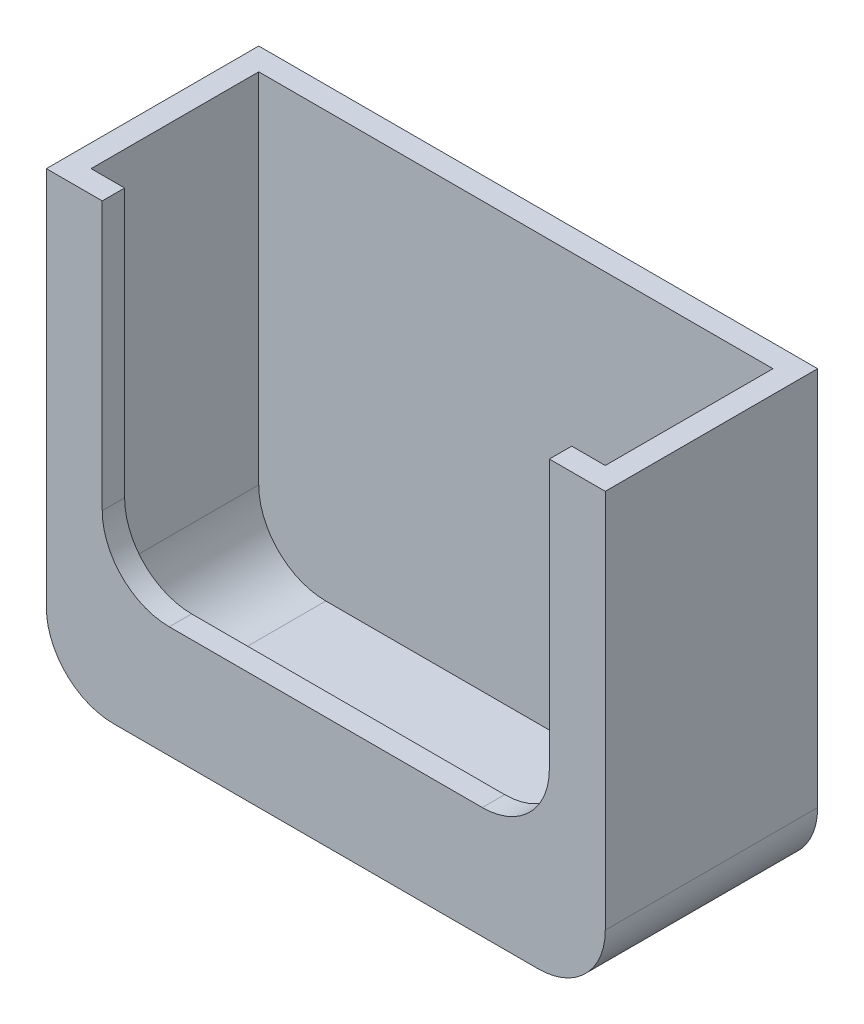
ISO-10303-21;
HEADER;
FILE_DESCRIPTION(('STEP AP214'),'2;1');
FILE_NAME('part.step','',(''),(''),'','','');
FILE_SCHEMA(('AUTOMOTIVE_DESIGN { 1 0 10303 214 1 1 1 1 }'));
ENDSEC;
DATA;
#1=APPLICATION_CONTEXT('core data for automotive mechanical design processes');
#2=APPLICATION_PROTOCOL_DEFINITION('international standard','automotive_design',2000,#1);
#3=PRODUCT_CONTEXT('',#1,'mechanical');
#4=PRODUCT('Part','Part','',(#3));
#5=PRODUCT_RELATED_PRODUCT_CATEGORY('part','',(#4));
#6=PRODUCT_DEFINITION_FORMATION('','',#4);
#7=PRODUCT_DEFINITION_CONTEXT('part definition',#1,'design');
#8=PRODUCT_DEFINITION('design','',#6,#7);
#9=PRODUCT_DEFINITION_SHAPE('','',#8);
#10=(LENGTH_UNIT() NAMED_UNIT(*) SI_UNIT(.MILLI.,.METRE.));
#11=(NAMED_UNIT(*) PLANE_ANGLE_UNIT() SI_UNIT($,.RADIAN.));
#12=(NAMED_UNIT(*) SI_UNIT($,.STERADIAN.) SOLID_ANGLE_UNIT());
#13=UNCERTAINTY_MEASURE_WITH_UNIT(LENGTH_MEASURE(1.E-05),#10,'distance_accuracy_value','');
#14=(GEOMETRIC_REPRESENTATION_CONTEXT(3) GLOBAL_UNCERTAINTY_ASSIGNED_CONTEXT((#13)) GLOBAL_UNIT_ASSIGNED_CONTEXT((#10,
#11,#12)) REPRESENTATION_CONTEXT('',''));
#15=CARTESIAN_POINT('',(0.,0.,0.));
#16=DIRECTION('',(0.,0.,1.));
#17=DIRECTION('',(1.,0.,0.));
#18=AXIS2_PLACEMENT_3D('',#15,#16,#17);
#19=CARTESIAN_POINT('',(25.,-20.,19.));
#20=DIRECTION('',(-1.,0.,0.));
#21=DIRECTION('',(0.,0.,1.));
#22=AXIS2_PLACEMENT_3D('',#19,#20,#21);
#23=PLANE('',#22);
#24=DIRECTION('',(0.,1.,0.));
#25=VECTOR('',#24,1.);
#26=CARTESIAN_POINT('',(25.,-20.,19.));
#27=LINE('',#26,#25);
#28=CARTESIAN_POINT('',(25.,-14.,19.));
#29=VERTEX_POINT('',#28);
#30=CARTESIAN_POINT('',(25.,20.,19.));
#31=VERTEX_POINT('',#30);
#32=EDGE_CURVE('E212',#29,#31,#27,.T.);
#33=ORIENTED_EDGE('',*,*,#32,.F.);
#34=DIRECTION('',(0.,0.,-1.));
#35=VECTOR('',#34,1.);
#36=CARTESIAN_POINT('',(25.,-14.,19.));
#37=LINE('',#36,#35);
#38=CARTESIAN_POINT('',(25.,-14.,0.));
#39=VERTEX_POINT('',#38);
#40=EDGE_CURVE('E253',#29,#39,#37,.T.);
#41=ORIENTED_EDGE('',*,*,#40,.T.);
#42=DIRECTION('',(0.,1.,0.));
#43=VECTOR('',#42,1.);
#44=CARTESIAN_POINT('',(25.,-20.,0.));
#45=LINE('',#44,#43);
#46=CARTESIAN_POINT('',(25.,20.,0.));
#47=VERTEX_POINT('',#46);
#48=EDGE_CURVE('E205',#39,#47,#45,.T.);
#49=ORIENTED_EDGE('',*,*,#48,.T.);
#50=DIRECTION('',(0.,0.,-1.));
#51=VECTOR('',#50,1.);
#52=CARTESIAN_POINT('',(25.,20.,19.));
#53=LINE('',#52,#51);
#54=EDGE_CURVE('E235',#31,#47,#53,.T.);
#55=ORIENTED_EDGE('',*,*,#54,.F.);
#56=EDGE_LOOP('',(#33,#41,#49,#55));
#57=FACE_BOUND('',#56,.T.);
#58=ADVANCED_FACE('F36',(#57),#23,.F.);
#59=CARTESIAN_POINT('',(-25.,20.,19.));
#60=DIRECTION('',(0.,-1.,0.));
#61=DIRECTION('',(0.,0.,-1.));
#62=AXIS2_PLACEMENT_3D('',#59,#60,#61);
#63=PLANE('',#62);
#64=DIRECTION('',(1.,0.,0.));
#65=VECTOR('',#64,1.);
#66=CARTESIAN_POINT('',(-23.,20.,17.));
#67=LINE('',#66,#65);
#68=CARTESIAN_POINT('',(20.,20.,17.));
#69=VERTEX_POINT('',#68);
#70=CARTESIAN_POINT('',(23.,20.,17.));
#71=VERTEX_POINT('',#70);
#72=EDGE_CURVE('E165',#69,#71,#67,.T.);
#73=ORIENTED_EDGE('',*,*,#72,.F.);
#74=DIRECTION('',(0.,0.,-1.));
#75=VECTOR('',#74,1.);
#76=CARTESIAN_POINT('',(20.,20.,19.));
#77=LINE('',#76,#75);
#78=CARTESIAN_POINT('',(20.,20.,19.));
#79=VERTEX_POINT('',#78);
#80=EDGE_CURVE('E174',#79,#69,#77,.T.);
#81=ORIENTED_EDGE('',*,*,#80,.F.);
#82=DIRECTION('',(-1.,0.,0.));
#83=VECTOR('',#82,1.);
#84=CARTESIAN_POINT('',(-25.,20.,19.));
#85=LINE('',#84,#83);
#86=EDGE_CURVE('E216',#31,#79,#85,.T.);
#87=ORIENTED_EDGE('',*,*,#86,.F.);
#88=ORIENTED_EDGE('',*,*,#54,.T.);
#89=DIRECTION('',(-1.,0.,0.));
#90=VECTOR('',#89,1.);
#91=CARTESIAN_POINT('',(-25.,20.,0.));
#92=LINE('',#91,#90);
#93=CARTESIAN_POINT('',(-25.,20.,0.));
#94=VERTEX_POINT('',#93);
#95=EDGE_CURVE('E226',#47,#94,#92,.T.);
#96=ORIENTED_EDGE('',*,*,#95,.T.);
#97=DIRECTION('',(0.,0.,-1.));
#98=VECTOR('',#97,1.);
#99=CARTESIAN_POINT('',(-25.,20.,19.));
#100=LINE('',#99,#98);
#101=CARTESIAN_POINT('',(-25.,20.,19.));
#102=VERTEX_POINT('',#101);
#103=EDGE_CURVE('E224',#102,#94,#100,.T.);
#104=ORIENTED_EDGE('',*,*,#103,.F.);
#105=CARTESIAN_POINT('',(-20.,20.,19.));
#106=VERTEX_POINT('',#105);
#107=EDGE_CURVE('E214',#106,#102,#85,.T.);
#108=ORIENTED_EDGE('',*,*,#107,.F.);
#109=DIRECTION('',(0.,0.,1.));
#110=VECTOR('',#109,1.);
#111=CARTESIAN_POINT('',(-20.,20.,19.));
#112=LINE('',#111,#110);
#113=CARTESIAN_POINT('',(-20.,20.,17.));
#114=VERTEX_POINT('',#113);
#115=EDGE_CURVE('E181',#114,#106,#112,.T.);
#116=ORIENTED_EDGE('',*,*,#115,.F.);
#117=CARTESIAN_POINT('',(-23.,20.,17.));
#118=VERTEX_POINT('',#117);
#119=EDGE_CURVE('E187',#118,#114,#67,.T.);
#120=ORIENTED_EDGE('',*,*,#119,.F.);
#121=DIRECTION('',(0.,0.,-1.));
#122=VECTOR('',#121,1.);
#123=CARTESIAN_POINT('',(-23.,20.,17.));
#124=LINE('',#123,#122);
#125=CARTESIAN_POINT('',(-23.,20.,2.));
#126=VERTEX_POINT('',#125);
#127=EDGE_CURVE('E199',#118,#126,#124,.T.);
#128=ORIENTED_EDGE('',*,*,#127,.T.);
#129=DIRECTION('',(1.,0.,0.));
#130=VECTOR('',#129,1.);
#131=CARTESIAN_POINT('',(-23.,20.,2.));
#132=LINE('',#131,#130);
#133=CARTESIAN_POINT('',(23.,20.,2.));
#134=VERTEX_POINT('',#133);
#135=EDGE_CURVE('E197',#126,#134,#132,.T.);
#136=ORIENTED_EDGE('',*,*,#135,.T.);
#137=DIRECTION('',(0.,0.,-1.));
#138=VECTOR('',#137,1.);
#139=CARTESIAN_POINT('',(23.,20.,17.));
#140=LINE('',#139,#138);
#141=EDGE_CURVE('E186',#71,#134,#140,.T.);
#142=ORIENTED_EDGE('',*,*,#141,.F.);
#143=EDGE_LOOP('',(#73,#81,#87,#88,#96,#104,#108,#116,#120,#128,#136,#142));
#144=FACE_BOUND('',#143,.T.);
#145=ADVANCED_FACE('F183',(#144),#63,.F.);
#146=CARTESIAN_POINT('',(-25.,-20.,19.));
#147=DIRECTION('',(1.,0.,0.));
#148=DIRECTION('',(0.,0.,-1.));
#149=AXIS2_PLACEMENT_3D('',#146,#147,#148);
#150=PLANE('',#149);
#151=DIRECTION('',(0.,-1.,0.));
#152=VECTOR('',#151,1.);
#153=CARTESIAN_POINT('',(-25.,-20.,0.));
#154=LINE('',#153,#152);
#155=CARTESIAN_POINT('',(-25.,-14.,0.));
#156=VERTEX_POINT('',#155);
#157=EDGE_CURVE('E228',#94,#156,#154,.T.);
#158=ORIENTED_EDGE('',*,*,#157,.T.);
#159=DIRECTION('',(0.,0.,-1.));
#160=VECTOR('',#159,1.);
#161=CARTESIAN_POINT('',(-25.,-14.,19.));
#162=LINE('',#161,#160);
#163=CARTESIAN_POINT('',(-25.,-14.,19.));
#164=VERTEX_POINT('',#163);
#165=EDGE_CURVE('E247',#156,#164,#162,.F.);
#166=ORIENTED_EDGE('',*,*,#165,.T.);
#167=DIRECTION('',(0.,-1.,0.));
#168=VECTOR('',#167,1.);
#169=CARTESIAN_POINT('',(-25.,-20.,19.));
#170=LINE('',#169,#168);
#171=EDGE_CURVE('E218',#102,#164,#170,.T.);
#172=ORIENTED_EDGE('',*,*,#171,.F.);
#173=ORIENTED_EDGE('',*,*,#103,.T.);
#174=EDGE_LOOP('',(#158,#166,#172,#173));
#175=FACE_BOUND('',#174,.T.);
#176=ADVANCED_FACE('F344',(#175),#150,.F.);
#177=CARTESIAN_POINT('',(-25.,-20.,19.));
#178=DIRECTION('',(0.,1.,0.));
#179=DIRECTION('',(0.,0.,1.));
#180=AXIS2_PLACEMENT_3D('',#177,#178,#179);
#181=PLANE('',#180);
#182=DIRECTION('',(1.,0.,0.));
#183=VECTOR('',#182,1.);
#184=CARTESIAN_POINT('',(-25.,-20.,19.));
#185=LINE('',#184,#183);
#186=CARTESIAN_POINT('',(-19.,-20.,19.));
#187=VERTEX_POINT('',#186);
#188=CARTESIAN_POINT('',(19.,-20.,19.));
#189=VERTEX_POINT('',#188);
#190=EDGE_CURVE('E221',#187,#189,#185,.T.);
#191=ORIENTED_EDGE('',*,*,#190,.F.);
#192=DIRECTION('',(0.,0.,-1.));
#193=VECTOR('',#192,1.);
#194=CARTESIAN_POINT('',(-19.,-20.,19.));
#195=LINE('',#194,#193);
#196=CARTESIAN_POINT('',(-19.,-20.,0.));
#197=VERTEX_POINT('',#196);
#198=EDGE_CURVE('E240',#187,#197,#195,.T.);
#199=ORIENTED_EDGE('',*,*,#198,.T.);
#200=DIRECTION('',(1.,0.,0.));
#201=VECTOR('',#200,1.);
#202=CARTESIAN_POINT('',(-25.,-20.,0.));
#203=LINE('',#202,#201);
#204=CARTESIAN_POINT('',(19.,-20.,0.));
#205=VERTEX_POINT('',#204);
#206=EDGE_CURVE('E215',#197,#205,#203,.T.);
#207=ORIENTED_EDGE('',*,*,#206,.T.);
#208=DIRECTION('',(0.,0.,-1.));
#209=VECTOR('',#208,1.);
#210=CARTESIAN_POINT('',(19.,-20.,19.));
#211=LINE('',#210,#209);
#212=EDGE_CURVE('E238',#205,#189,#211,.F.);
#213=ORIENTED_EDGE('',*,*,#212,.T.);
#214=EDGE_LOOP('',(#191,#199,#207,#213));
#215=FACE_BOUND('',#214,.T.);
#216=ADVANCED_FACE('F352',(#215),#181,.F.);
#217=CARTESIAN_POINT('',(0.,0.,19.));
#218=DIRECTION('',(0.,0.,-1.));
#219=DIRECTION('',(-1.,0.,0.));
#220=AXIS2_PLACEMENT_3D('',#217,#218,#219);
#221=PLANE('',#220);
#222=ORIENTED_EDGE('',*,*,#171,.T.);
#223=CARTESIAN_POINT('',(-19.,-14.,19.));
#224=DIRECTION('',(0.,0.,-1.));
#225=DIRECTION('',(-1.,0.,0.));
#226=AXIS2_PLACEMENT_3D('',#223,#224,#225);
#227=CIRCLE('',#226,6.);
#228=EDGE_CURVE('E251',#164,#187,#227,.F.);
#229=ORIENTED_EDGE('',*,*,#228,.T.);
#230=ORIENTED_EDGE('',*,*,#190,.T.);
#231=CARTESIAN_POINT('',(19.,-14.,19.));
#232=DIRECTION('',(0.,0.,-1.));
#233=DIRECTION('',(-1.,0.,0.));
#234=AXIS2_PLACEMENT_3D('',#231,#232,#233);
#235=CIRCLE('',#234,6.);
#236=EDGE_CURVE('E249',#189,#29,#235,.F.);
#237=ORIENTED_EDGE('',*,*,#236,.T.);
#238=ORIENTED_EDGE('',*,*,#32,.T.);
#239=ORIENTED_EDGE('',*,*,#86,.T.);
#240=DIRECTION('',(0.,1.,0.));
#241=VECTOR('',#240,1.);
#242=CARTESIAN_POINT('',(20.,-10.,19.));
#243=LINE('',#242,#241);
#244=CARTESIAN_POINT('',(20.,-4.,19.));
#245=VERTEX_POINT('',#244);
#246=EDGE_CURVE('E177',#245,#79,#243,.T.);
#247=ORIENTED_EDGE('',*,*,#246,.F.);
#248=CARTESIAN_POINT('',(14.,-4.,19.));
#249=DIRECTION('',(0.,0.,-1.));
#250=DIRECTION('',(-1.,0.,0.));
#251=AXIS2_PLACEMENT_3D('',#248,#249,#250);
#252=CIRCLE('',#251,6.);
#253=CARTESIAN_POINT('',(14.,-10.,19.));
#254=VERTEX_POINT('',#253);
#255=EDGE_CURVE('E11',#245,#254,#252,.T.);
#256=ORIENTED_EDGE('',*,*,#255,.T.);
#257=DIRECTION('',(1.,0.,0.));
#258=VECTOR('',#257,1.);
#259=CARTESIAN_POINT('',(-20.,-10.,19.));
#260=LINE('',#259,#258);
#261=CARTESIAN_POINT('',(-14.,-10.,19.));
#262=VERTEX_POINT('',#261);
#263=EDGE_CURVE('E171',#262,#254,#260,.T.);
#264=ORIENTED_EDGE('',*,*,#263,.F.);
#265=CARTESIAN_POINT('',(-14.,-4.,19.));
#266=DIRECTION('',(0.,0.,-1.));
#267=DIRECTION('',(-1.,0.,0.));
#268=AXIS2_PLACEMENT_3D('',#265,#266,#267);
#269=CIRCLE('',#268,6.);
#270=CARTESIAN_POINT('',(-20.,-4.,19.));
#271=VERTEX_POINT('',#270);
#272=EDGE_CURVE('E282',#262,#271,#269,.T.);
#273=ORIENTED_EDGE('',*,*,#272,.T.);
#274=DIRECTION('',(0.,1.,0.));
#275=VECTOR('',#274,1.);
#276=CARTESIAN_POINT('',(-20.,-10.,19.));
#277=LINE('',#276,#275);
#278=EDGE_CURVE('E190',#271,#106,#277,.T.);
#279=ORIENTED_EDGE('',*,*,#278,.T.);
#280=ORIENTED_EDGE('',*,*,#107,.T.);
#281=EDGE_LOOP('',(#222,#229,#230,#237,#238,#239,#247,#256,#264,#273,#279,#280));
#282=FACE_BOUND('',#281,.T.);
#283=ADVANCED_FACE('F301',(#282),#221,.F.);
#284=CARTESIAN_POINT('',(0.,0.,0.));
#285=DIRECTION('',(0.,0.,-1.));
#286=DIRECTION('',(-1.,0.,0.));
#287=AXIS2_PLACEMENT_3D('',#284,#285,#286);
#288=PLANE('',#287);
#289=ORIENTED_EDGE('',*,*,#206,.F.);
#290=CARTESIAN_POINT('',(-19.,-14.,0.));
#291=DIRECTION('',(0.,0.,-1.));
#292=DIRECTION('',(-1.,0.,0.));
#293=AXIS2_PLACEMENT_3D('',#290,#291,#292);
#294=CIRCLE('',#293,6.);
#295=EDGE_CURVE('E245',#197,#156,#294,.T.);
#296=ORIENTED_EDGE('',*,*,#295,.T.);
#297=ORIENTED_EDGE('',*,*,#157,.F.);
#298=ORIENTED_EDGE('',*,*,#95,.F.);
#299=ORIENTED_EDGE('',*,*,#48,.F.);
#300=CARTESIAN_POINT('',(19.,-14.,0.));
#301=DIRECTION('',(0.,0.,-1.));
#302=DIRECTION('',(-1.,0.,0.));
#303=AXIS2_PLACEMENT_3D('',#300,#301,#302);
#304=CIRCLE('',#303,6.);
#305=EDGE_CURVE('E243',#39,#205,#304,.T.);
#306=ORIENTED_EDGE('',*,*,#305,.T.);
#307=EDGE_LOOP('',(#289,#296,#297,#298,#299,#306));
#308=FACE_BOUND('',#307,.T.);
#309=ADVANCED_FACE('F341',(#308),#288,.T.);
#310=CARTESIAN_POINT('',(-23.,-18.,17.));
#311=DIRECTION('',(0.,0.,1.));
#312=DIRECTION('',(1.,0.,0.));
#313=AXIS2_PLACEMENT_3D('',#310,#311,#312);
#314=PLANE('',#313);
#315=DIRECTION('',(0.,1.,0.));
#316=VECTOR('',#315,1.);
#317=CARTESIAN_POINT('',(23.,-18.,17.));
#318=LINE('',#317,#316);
#319=CARTESIAN_POINT('',(23.,-12.,17.));
#320=VERTEX_POINT('',#319);
#321=EDGE_CURVE('E210',#320,#71,#318,.T.);
#322=ORIENTED_EDGE('',*,*,#321,.F.);
#323=CARTESIAN_POINT('',(17.,-12.,17.));
#324=DIRECTION('',(0.,0.,1.));
#325=DIRECTION('',(1.,0.,0.));
#326=AXIS2_PLACEMENT_3D('',#323,#324,#325);
#327=CIRCLE('',#326,6.);
#328=CARTESIAN_POINT('',(17.,-18.,17.));
#329=VERTEX_POINT('',#328);
#330=EDGE_CURVE('E277',#320,#329,#327,.F.);
#331=ORIENTED_EDGE('',*,*,#330,.T.);
#332=DIRECTION('',(1.,0.,0.));
#333=VECTOR('',#332,1.);
#334=CARTESIAN_POINT('',(-23.,-18.,17.));
#335=LINE('',#334,#333);
#336=CARTESIAN_POINT('',(-17.,-18.,17.));
#337=VERTEX_POINT('',#336);
#338=EDGE_CURVE('E202',#337,#329,#335,.T.);
#339=ORIENTED_EDGE('',*,*,#338,.F.);
#340=CARTESIAN_POINT('',(-17.,-12.,17.));
#341=DIRECTION('',(0.,0.,1.));
#342=DIRECTION('',(1.,0.,0.));
#343=AXIS2_PLACEMENT_3D('',#340,#341,#342);
#344=CIRCLE('',#343,6.);
#345=CARTESIAN_POINT('',(-23.,-12.,17.));
#346=VERTEX_POINT('',#345);
#347=EDGE_CURVE('E51',#337,#346,#344,.F.);
#348=ORIENTED_EDGE('',*,*,#347,.T.);
#349=DIRECTION('',(0.,1.,0.));
#350=VECTOR('',#349,1.);
#351=CARTESIAN_POINT('',(-23.,-18.,17.));
#352=LINE('',#351,#350);
#353=EDGE_CURVE('E203',#346,#118,#352,.T.);
#354=ORIENTED_EDGE('',*,*,#353,.T.);
#355=ORIENTED_EDGE('',*,*,#119,.T.);
#356=DIRECTION('',(0.,1.,0.));
#357=VECTOR('',#356,1.);
#358=CARTESIAN_POINT('',(-20.,-10.,17.));
#359=LINE('',#358,#357);
#360=CARTESIAN_POINT('',(-20.,-4.,17.));
#361=VERTEX_POINT('',#360);
#362=EDGE_CURVE('E170',#361,#114,#359,.T.);
#363=ORIENTED_EDGE('',*,*,#362,.F.);
#364=CARTESIAN_POINT('',(-14.,-4.,17.));
#365=DIRECTION('',(0.,0.,1.));
#366=DIRECTION('',(1.,0.,0.));
#367=AXIS2_PLACEMENT_3D('',#364,#365,#366);
#368=CIRCLE('',#367,6.);
#369=CARTESIAN_POINT('',(-14.,-10.,17.));
#370=VERTEX_POINT('',#369);
#371=EDGE_CURVE('E284',#361,#370,#368,.T.);
#372=ORIENTED_EDGE('',*,*,#371,.T.);
#373=DIRECTION('',(-1.,0.,0.));
#374=VECTOR('',#373,1.);
#375=CARTESIAN_POINT('',(-20.,-10.,17.));
#376=LINE('',#375,#374);
#377=CARTESIAN_POINT('',(14.,-10.,17.));
#378=VERTEX_POINT('',#377);
#379=EDGE_CURVE('E288',#378,#370,#376,.T.);
#380=ORIENTED_EDGE('',*,*,#379,.F.);
#381=CARTESIAN_POINT('',(14.,-4.,17.));
#382=DIRECTION('',(0.,0.,1.));
#383=DIRECTION('',(1.,0.,0.));
#384=AXIS2_PLACEMENT_3D('',#381,#382,#383);
#385=CIRCLE('',#384,6.);
#386=CARTESIAN_POINT('',(20.,-4.,17.));
#387=VERTEX_POINT('',#386);
#388=EDGE_CURVE('E44',#378,#387,#385,.T.);
#389=ORIENTED_EDGE('',*,*,#388,.T.);
#390=DIRECTION('',(0.,1.,0.));
#391=VECTOR('',#390,1.);
#392=CARTESIAN_POINT('',(20.,-10.,17.));
#393=LINE('',#392,#391);
#394=EDGE_CURVE('E161',#387,#69,#393,.T.);
#395=ORIENTED_EDGE('',*,*,#394,.T.);
#396=ORIENTED_EDGE('',*,*,#72,.T.);
#397=EDGE_LOOP('',(#322,#331,#339,#348,#354,#355,#363,#372,#380,#389,#395,#396));
#398=FACE_BOUND('',#397,.T.);
#399=ADVANCED_FACE('F163',(#398),#314,.F.);
#400=CARTESIAN_POINT('',(-23.,-18.,17.));
#401=DIRECTION('',(1.,0.,0.));
#402=DIRECTION('',(0.,0.,-1.));
#403=AXIS2_PLACEMENT_3D('',#400,#401,#402);
#404=PLANE('',#403);
#405=ORIENTED_EDGE('',*,*,#353,.F.);
#406=DIRECTION('',(0.,0.,-1.));
#407=VECTOR('',#406,1.);
#408=CARTESIAN_POINT('',(-23.,-12.,2.));
#409=LINE('',#408,#407);
#410=CARTESIAN_POINT('',(-23.,-12.,2.));
#411=VERTEX_POINT('',#410);
#412=EDGE_CURVE('E279',#346,#411,#409,.T.);
#413=ORIENTED_EDGE('',*,*,#412,.T.);
#414=DIRECTION('',(0.,1.,0.));
#415=VECTOR('',#414,1.);
#416=CARTESIAN_POINT('',(-23.,-18.,2.));
#417=LINE('',#416,#415);
#418=EDGE_CURVE('E206',#411,#126,#417,.T.);
#419=ORIENTED_EDGE('',*,*,#418,.T.);
#420=ORIENTED_EDGE('',*,*,#127,.F.);
#421=EDGE_LOOP('',(#405,#413,#419,#420));
#422=FACE_BOUND('',#421,.T.);
#423=ADVANCED_FACE('F323',(#422),#404,.T.);
#424=CARTESIAN_POINT('',(-23.,-18.,2.));
#425=DIRECTION('',(0.,0.,1.));
#426=DIRECTION('',(1.,0.,0.));
#427=AXIS2_PLACEMENT_3D('',#424,#425,#426);
#428=PLANE('',#427);
#429=DIRECTION('',(1.,0.,0.));
#430=VECTOR('',#429,1.);
#431=CARTESIAN_POINT('',(-23.,-18.,2.));
#432=LINE('',#431,#430);
#433=CARTESIAN_POINT('',(-17.,-18.,2.));
#434=VERTEX_POINT('',#433);
#435=CARTESIAN_POINT('',(17.,-18.,2.));
#436=VERTEX_POINT('',#435);
#437=EDGE_CURVE('E194',#434,#436,#432,.T.);
#438=ORIENTED_EDGE('',*,*,#437,.T.);
#439=CARTESIAN_POINT('',(17.,-12.,2.));
#440=DIRECTION('',(0.,0.,1.));
#441=DIRECTION('',(1.,0.,0.));
#442=AXIS2_PLACEMENT_3D('',#439,#440,#441);
#443=CIRCLE('',#442,6.);
#444=CARTESIAN_POINT('',(23.,-12.,2.));
#445=VERTEX_POINT('',#444);
#446=EDGE_CURVE('E273',#436,#445,#443,.T.);
#447=ORIENTED_EDGE('',*,*,#446,.T.);
#448=DIRECTION('',(0.,1.,0.));
#449=VECTOR('',#448,1.);
#450=CARTESIAN_POINT('',(23.,-18.,2.));
#451=LINE('',#450,#449);
#452=EDGE_CURVE('E208',#445,#134,#451,.T.);
#453=ORIENTED_EDGE('',*,*,#452,.T.);
#454=ORIENTED_EDGE('',*,*,#135,.F.);
#455=ORIENTED_EDGE('',*,*,#418,.F.);
#456=CARTESIAN_POINT('',(-17.,-12.,2.));
#457=DIRECTION('',(0.,0.,1.));
#458=DIRECTION('',(1.,0.,0.));
#459=AXIS2_PLACEMENT_3D('',#456,#457,#458);
#460=CIRCLE('',#459,6.);
#461=EDGE_CURVE('E271',#411,#434,#460,.T.);
#462=ORIENTED_EDGE('',*,*,#461,.T.);
#463=EDGE_LOOP('',(#438,#447,#453,#454,#455,#462));
#464=FACE_BOUND('',#463,.T.);
#465=ADVANCED_FACE('F316',(#464),#428,.T.);
#466=CARTESIAN_POINT('',(23.,-18.,17.));
#467=DIRECTION('',(1.,0.,0.));
#468=DIRECTION('',(0.,0.,-1.));
#469=AXIS2_PLACEMENT_3D('',#466,#467,#468);
#470=PLANE('',#469);
#471=ORIENTED_EDGE('',*,*,#452,.F.);
#472=DIRECTION('',(0.,0.,-1.));
#473=VECTOR('',#472,1.);
#474=CARTESIAN_POINT('',(23.,-12.,17.));
#475=LINE('',#474,#473);
#476=EDGE_CURVE('E59',#445,#320,#475,.F.);
#477=ORIENTED_EDGE('',*,*,#476,.T.);
#478=ORIENTED_EDGE('',*,*,#321,.T.);
#479=ORIENTED_EDGE('',*,*,#141,.T.);
#480=EDGE_LOOP('',(#471,#477,#478,#479));
#481=FACE_BOUND('',#480,.T.);
#482=ADVANCED_FACE('F382',(#481),#470,.F.);
#483=CARTESIAN_POINT('',(0.,-18.,0.));
#484=DIRECTION('',(0.,1.,0.));
#485=DIRECTION('',(0.,0.,1.));
#486=AXIS2_PLACEMENT_3D('',#483,#484,#485);
#487=PLANE('',#486);
#488=ORIENTED_EDGE('',*,*,#338,.T.);
#489=DIRECTION('',(0.,0.,-1.));
#490=VECTOR('',#489,1.);
#491=CARTESIAN_POINT('',(17.,-18.,0.));
#492=LINE('',#491,#490);
#493=EDGE_CURVE('E268',#329,#436,#492,.T.);
#494=ORIENTED_EDGE('',*,*,#493,.T.);
#495=ORIENTED_EDGE('',*,*,#437,.F.);
#496=DIRECTION('',(0.,0.,-1.));
#497=VECTOR('',#496,1.);
#498=CARTESIAN_POINT('',(-17.,-18.,17.));
#499=LINE('',#498,#497);
#500=EDGE_CURVE('E266',#434,#337,#499,.F.);
#501=ORIENTED_EDGE('',*,*,#500,.T.);
#502=EDGE_LOOP('',(#488,#494,#495,#501));
#503=FACE_BOUND('',#502,.T.);
#504=ADVANCED_FACE('F319',(#503),#487,.T.);
#505=CARTESIAN_POINT('',(20.,-10.,19.));
#506=DIRECTION('',(1.,0.,0.));
#507=DIRECTION('',(0.,0.,-1.));
#508=AXIS2_PLACEMENT_3D('',#505,#506,#507);
#509=PLANE('',#508);
#510=ORIENTED_EDGE('',*,*,#394,.F.);
#511=DIRECTION('',(0.,0.,-1.));
#512=VECTOR('',#511,1.);
#513=CARTESIAN_POINT('',(20.,-4.,19.));
#514=LINE('',#513,#512);
#515=EDGE_CURVE('E264',#387,#245,#514,.F.);
#516=ORIENTED_EDGE('',*,*,#515,.T.);
#517=ORIENTED_EDGE('',*,*,#246,.T.);
#518=ORIENTED_EDGE('',*,*,#80,.T.);
#519=EDGE_LOOP('',(#510,#516,#517,#518));
#520=FACE_BOUND('',#519,.T.);
#521=ADVANCED_FACE('F175',(#520),#509,.F.);
#522=CARTESIAN_POINT('',(-20.,-10.,19.));
#523=DIRECTION('',(-1.,0.,0.));
#524=DIRECTION('',(0.,0.,1.));
#525=AXIS2_PLACEMENT_3D('',#522,#523,#524);
#526=PLANE('',#525);
#527=ORIENTED_EDGE('',*,*,#278,.F.);
#528=DIRECTION('',(0.,0.,1.));
#529=VECTOR('',#528,1.);
#530=CARTESIAN_POINT('',(-20.,-4.,17.));
#531=LINE('',#530,#529);
#532=EDGE_CURVE('E262',#271,#361,#531,.F.);
#533=ORIENTED_EDGE('',*,*,#532,.T.);
#534=ORIENTED_EDGE('',*,*,#362,.T.);
#535=ORIENTED_EDGE('',*,*,#115,.T.);
#536=EDGE_LOOP('',(#527,#533,#534,#535));
#537=FACE_BOUND('',#536,.T.);
#538=ADVANCED_FACE('F304',(#537),#526,.F.);
#539=CARTESIAN_POINT('',(0.,-10.,0.));
#540=DIRECTION('',(0.,-1.,0.));
#541=DIRECTION('',(0.,0.,-1.));
#542=AXIS2_PLACEMENT_3D('',#539,#540,#541);
#543=PLANE('',#542);
#544=ORIENTED_EDGE('',*,*,#379,.T.);
#545=DIRECTION('',(0.,0.,1.));
#546=VECTOR('',#545,1.);
#547=CARTESIAN_POINT('',(-14.,-10.,19.));
#548=LINE('',#547,#546);
#549=EDGE_CURVE('E259',#370,#262,#548,.T.);
#550=ORIENTED_EDGE('',*,*,#549,.T.);
#551=ORIENTED_EDGE('',*,*,#263,.T.);
#552=DIRECTION('',(0.,0.,-1.));
#553=VECTOR('',#552,1.);
#554=CARTESIAN_POINT('',(14.,-10.,17.));
#555=LINE('',#554,#553);
#556=EDGE_CURVE('E256',#254,#378,#555,.T.);
#557=ORIENTED_EDGE('',*,*,#556,.T.);
#558=EDGE_LOOP('',(#544,#550,#551,#557));
#559=FACE_BOUND('',#558,.T.);
#560=ADVANCED_FACE('F293',(#559),#543,.F.);
#561=CARTESIAN_POINT('',(-19.,-14.,19.));
#562=DIRECTION('',(0.,0.,-1.));
#563=DIRECTION('',(-1.,0.,0.));
#564=AXIS2_PLACEMENT_3D('',#561,#562,#563);
#565=CYLINDRICAL_SURFACE('',#564,6.);
#566=ORIENTED_EDGE('',*,*,#228,.F.);
#567=ORIENTED_EDGE('',*,*,#165,.F.);
#568=ORIENTED_EDGE('',*,*,#295,.F.);
#569=ORIENTED_EDGE('',*,*,#198,.F.);
#570=EDGE_LOOP('',(#566,#567,#568,#569));
#571=FACE_BOUND('',#570,.T.);
#572=ADVANCED_FACE('F350',(#571),#565,.T.);
#573=CARTESIAN_POINT('',(19.,-14.,19.));
#574=DIRECTION('',(0.,0.,-1.));
#575=DIRECTION('',(-1.,0.,0.));
#576=AXIS2_PLACEMENT_3D('',#573,#574,#575);
#577=CYLINDRICAL_SURFACE('',#576,6.);
#578=ORIENTED_EDGE('',*,*,#236,.F.);
#579=ORIENTED_EDGE('',*,*,#212,.F.);
#580=ORIENTED_EDGE('',*,*,#305,.F.);
#581=ORIENTED_EDGE('',*,*,#40,.F.);
#582=EDGE_LOOP('',(#578,#579,#580,#581));
#583=FACE_BOUND('',#582,.T.);
#584=ADVANCED_FACE('F356',(#583),#577,.T.);
#585=CARTESIAN_POINT('',(-14.,-4.,0.));
#586=DIRECTION('',(0.,0.,-1.));
#587=DIRECTION('',(-1.,0.,0.));
#588=AXIS2_PLACEMENT_3D('',#585,#586,#587);
#589=CYLINDRICAL_SURFACE('',#588,6.);
#590=ORIENTED_EDGE('',*,*,#371,.F.);
#591=ORIENTED_EDGE('',*,*,#532,.F.);
#592=ORIENTED_EDGE('',*,*,#272,.F.);
#593=ORIENTED_EDGE('',*,*,#549,.F.);
#594=EDGE_LOOP('',(#590,#591,#592,#593));
#595=FACE_BOUND('',#594,.T.);
#596=ADVANCED_FACE('F298',(#595),#589,.F.);
#597=CARTESIAN_POINT('',(14.,-4.,0.));
#598=DIRECTION('',(0.,0.,1.));
#599=DIRECTION('',(1.,0.,0.));
#600=AXIS2_PLACEMENT_3D('',#597,#598,#599);
#601=CYLINDRICAL_SURFACE('',#600,6.);
#602=ORIENTED_EDGE('',*,*,#255,.F.);
#603=ORIENTED_EDGE('',*,*,#515,.F.);
#604=ORIENTED_EDGE('',*,*,#388,.F.);
#605=ORIENTED_EDGE('',*,*,#556,.F.);
#606=EDGE_LOOP('',(#602,#603,#604,#605));
#607=FACE_BOUND('',#606,.T.);
#608=ADVANCED_FACE('F331',(#607),#601,.F.);
#609=CARTESIAN_POINT('',(17.,-12.,0.));
#610=DIRECTION('',(0.,0.,-1.));
#611=DIRECTION('',(-1.,0.,0.));
#612=AXIS2_PLACEMENT_3D('',#609,#610,#611);
#613=CYLINDRICAL_SURFACE('',#612,6.);
#614=ORIENTED_EDGE('',*,*,#330,.F.);
#615=ORIENTED_EDGE('',*,*,#476,.F.);
#616=ORIENTED_EDGE('',*,*,#446,.F.);
#617=ORIENTED_EDGE('',*,*,#493,.F.);
#618=EDGE_LOOP('',(#614,#615,#616,#617));
#619=FACE_BOUND('',#618,.T.);
#620=ADVANCED_FACE('F423',(#619),#613,.F.);
#621=CARTESIAN_POINT('',(-17.,-12.,17.));
#622=DIRECTION('',(0.,0.,1.));
#623=DIRECTION('',(1.,0.,0.));
#624=AXIS2_PLACEMENT_3D('',#621,#622,#623);
#625=CYLINDRICAL_SURFACE('',#624,6.);
#626=ORIENTED_EDGE('',*,*,#347,.F.);
#627=ORIENTED_EDGE('',*,*,#500,.F.);
#628=ORIENTED_EDGE('',*,*,#461,.F.);
#629=ORIENTED_EDGE('',*,*,#412,.F.);
#630=EDGE_LOOP('',(#626,#627,#628,#629));
#631=FACE_BOUND('',#630,.T.);
#632=ADVANCED_FACE('F38',(#631),#625,.F.);
#633=CLOSED_SHELL('',(#58,#145,#176,#216,#283,#309,#399,#423,#465,#482,#504,#521,#538,#560,#572,
#584,#596,#608,#620,#632));
#634=MANIFOLD_SOLID_BREP('B2',#633);
#635=ADVANCED_BREP_SHAPE_REPRESENTATION('',(#18,#634),#14);
#636=SHAPE_DEFINITION_REPRESENTATION(#9,#635);
ENDSEC;
END-ISO-10303-21;
